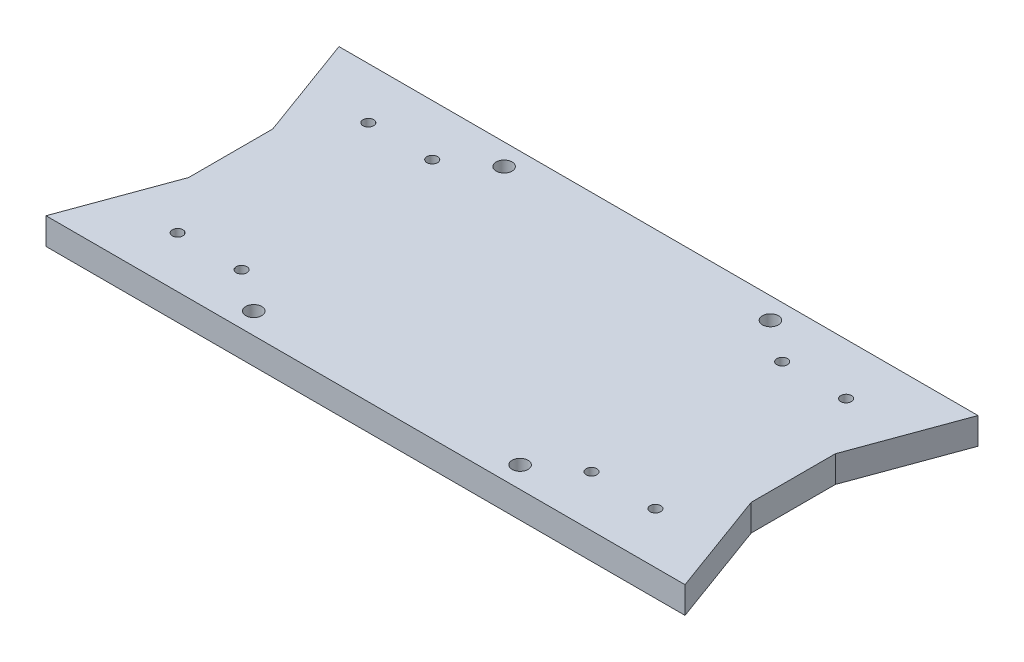
ISO-10303-21;
HEADER;
FILE_DESCRIPTION(('STEP AP214'),'2;1');
FILE_NAME('part.step','',(''),(''),'','','');
FILE_SCHEMA(('AUTOMOTIVE_DESIGN { 1 0 10303 214 1 1 1 1 }'));
ENDSEC;
DATA;
#1=APPLICATION_CONTEXT('core data for automotive mechanical design processes');
#2=APPLICATION_PROTOCOL_DEFINITION('international standard','automotive_design',2000,#1);
#3=PRODUCT_CONTEXT('',#1,'mechanical');
#4=PRODUCT('Part','Part','',(#3));
#5=PRODUCT_RELATED_PRODUCT_CATEGORY('part','',(#4));
#6=PRODUCT_DEFINITION_FORMATION('','',#4);
#7=PRODUCT_DEFINITION_CONTEXT('part definition',#1,'design');
#8=PRODUCT_DEFINITION('design','',#6,#7);
#9=PRODUCT_DEFINITION_SHAPE('','',#8);
#10=(LENGTH_UNIT() NAMED_UNIT(*) SI_UNIT(.MILLI.,.METRE.));
#11=(NAMED_UNIT(*) PLANE_ANGLE_UNIT() SI_UNIT($,.RADIAN.));
#12=(NAMED_UNIT(*) SI_UNIT($,.STERADIAN.) SOLID_ANGLE_UNIT());
#13=UNCERTAINTY_MEASURE_WITH_UNIT(LENGTH_MEASURE(1.E-05),#10,'distance_accuracy_value','');
#14=(GEOMETRIC_REPRESENTATION_CONTEXT(3) GLOBAL_UNCERTAINTY_ASSIGNED_CONTEXT((#13)) GLOBAL_UNIT_ASSIGNED_CONTEXT((#10,
#11,#12)) REPRESENTATION_CONTEXT('',''));
#15=CARTESIAN_POINT('',(0.,0.,0.));
#16=DIRECTION('',(0.,0.,1.));
#17=DIRECTION('',(1.,0.,0.));
#18=AXIS2_PLACEMENT_3D('',#15,#16,#17);
#19=CARTESIAN_POINT('',(-105.394952442636,6.35,-32.7826613509761));
#20=DIRECTION('',(-1.,0.,0.));
#21=DIRECTION('',(0.,0.,1.));
#22=AXIS2_PLACEMENT_3D('',#19,#20,#21);
#23=PLANE('',#22);
#24=DIRECTION('',(0.,0.,1.));
#25=VECTOR('',#24,1.);
#26=CARTESIAN_POINT('',(-105.394952442636,6.35,-32.7826613509761));
#27=LINE('',#26,#25);
#28=CARTESIAN_POINT('',(-105.394952442636,6.35,-77.7376613569761));
#29=VERTEX_POINT('',#28);
#30=CARTESIAN_POINT('',(-105.394952442636,6.35,-57.6776613449761));
#31=VERTEX_POINT('',#30);
#32=EDGE_CURVE('E105',#29,#31,#27,.T.);
#33=ORIENTED_EDGE('',*,*,#32,.F.);
#34=DIRECTION('',(0.,1.,0.));
#35=VECTOR('',#34,1.);
#36=CARTESIAN_POINT('',(-105.394952442636,0.,-77.7376613569761));
#37=LINE('',#36,#35);
#38=CARTESIAN_POINT('',(-105.394952442636,0.,-77.7376613569761));
#39=VERTEX_POINT('',#38);
#40=EDGE_CURVE('E142',#39,#29,#37,.T.);
#41=ORIENTED_EDGE('',*,*,#40,.F.);
#42=DIRECTION('',(0.,0.,-1.));
#43=VECTOR('',#42,1.);
#44=CARTESIAN_POINT('',(-105.394952442636,0.,-32.7826613509761));
#45=LINE('',#44,#43);
#46=CARTESIAN_POINT('',(-105.394952442636,0.,-57.6776613449761));
#47=VERTEX_POINT('',#46);
#48=EDGE_CURVE('E57',#47,#39,#45,.T.);
#49=ORIENTED_EDGE('',*,*,#48,.F.);
#50=DIRECTION('',(0.,1.,0.));
#51=VECTOR('',#50,1.);
#52=CARTESIAN_POINT('',(-105.394952442636,0.,-57.6776613449761));
#53=LINE('',#52,#51);
#54=EDGE_CURVE('E117',#47,#31,#53,.T.);
#55=ORIENTED_EDGE('',*,*,#54,.T.);
#56=EDGE_LOOP('',(#33,#41,#49,#55));
#57=FACE_BOUND('',#56,.T.);
#58=ADVANCED_FACE('F39',(#57),#23,.T.);
#59=CARTESIAN_POINT('',(0.,6.35,0.));
#60=DIRECTION('',(0.,-1.,0.));
#61=DIRECTION('',(0.,0.,-1.));
#62=AXIS2_PLACEMENT_3D('',#59,#60,#61);
#63=PLANE('',#62);
#64=CARTESIAN_POINT('',(-70.0586741186357,6.35,-97.5526613509762));
#65=DIRECTION('',(0.,1.,0.));
#66=DIRECTION('',(0.,0.,1.));
#67=AXIS2_PLACEMENT_3D('',#64,#65,#66);
#68=CIRCLE('',#67,1.90499999999999);
#69=CARTESIAN_POINT('',(-70.0586741186357,6.35,-95.6476613509762));
#70=VERTEX_POINT('',#69);
#71=EDGE_CURVE('E495',#70,#70,#68,.T.);
#72=ORIENTED_EDGE('',*,*,#71,.F.);
#73=EDGE_LOOP('',(#72));
#74=FACE_BOUND('',#73,.T.);
#75=CARTESIAN_POINT('',(-6.5586741186357,6.35,-97.5526613509762));
#76=DIRECTION('',(0.,1.,0.));
#77=DIRECTION('',(0.,0.,1.));
#78=AXIS2_PLACEMENT_3D('',#75,#76,#77);
#79=CIRCLE('',#78,1.90499999999999);
#80=CARTESIAN_POINT('',(-6.5586741186357,6.35,-95.6476613509762));
#81=VERTEX_POINT('',#80);
#82=EDGE_CURVE('E492',#81,#81,#79,.T.);
#83=ORIENTED_EDGE('',*,*,#82,.F.);
#84=EDGE_LOOP('',(#83));
#85=FACE_BOUND('',#84,.T.);
#86=CARTESIAN_POINT('',(-70.0586741186357,6.35,-37.8626613509762));
#87=DIRECTION('',(0.,1.,0.));
#88=DIRECTION('',(0.,0.,1.));
#89=AXIS2_PLACEMENT_3D('',#86,#87,#88);
#90=CIRCLE('',#89,1.90499999999999);
#91=CARTESIAN_POINT('',(-70.0586741186357,6.35,-35.9576613509762));
#92=VERTEX_POINT('',#91);
#93=EDGE_CURVE('E496',#92,#92,#90,.T.);
#94=ORIENTED_EDGE('',*,*,#93,.F.);
#95=EDGE_LOOP('',(#94));
#96=FACE_BOUND('',#95,.T.);
#97=CARTESIAN_POINT('',(-6.5586741186357,6.35,-37.8626613509762));
#98=DIRECTION('',(0.,1.,0.));
#99=DIRECTION('',(0.,0.,1.));
#100=AXIS2_PLACEMENT_3D('',#97,#98,#99);
#101=CIRCLE('',#100,1.90499999999999);
#102=CARTESIAN_POINT('',(-6.5586741186357,6.35,-35.9576613509762));
#103=VERTEX_POINT('',#102);
#104=EDGE_CURVE('E261',#103,#103,#101,.T.);
#105=ORIENTED_EDGE('',*,*,#104,.F.);
#106=EDGE_LOOP('',(#105));
#107=FACE_BOUND('',#106,.T.);
#108=ORIENTED_EDGE('',*,*,#32,.T.);
#109=DIRECTION('',(0.343774305183413,0.,-0.939052302641158));
#110=VECTOR('',#109,1.);
#111=CARTESIAN_POINT('',(-105.394952442636,6.35,-57.6776613449761));
#112=LINE('',#111,#110);
#113=CARTESIAN_POINT('',(-114.508674118636,6.35,-32.7826613509761));
#114=VERTEX_POINT('',#113);
#115=EDGE_CURVE('E109',#114,#31,#112,.T.);
#116=ORIENTED_EDGE('',*,*,#115,.F.);
#117=DIRECTION('',(1.,0.,0.));
#118=VECTOR('',#117,1.);
#119=CARTESIAN_POINT('',(-38.3336654810452,6.35,-32.7826613509761));
#120=LINE('',#119,#118);
#121=CARTESIAN_POINT('',(37.8413431565453,6.35,-32.7826613509761));
#122=VERTEX_POINT('',#121);
#123=EDGE_CURVE('E49',#114,#122,#120,.T.);
#124=ORIENTED_EDGE('',*,*,#123,.T.);
#125=DIRECTION('',(-0.343774305183413,0.,-0.939052302641158));
#126=VECTOR('',#125,1.);
#127=CARTESIAN_POINT('',(28.7276214805453,6.35,-57.6776613449761));
#128=LINE('',#127,#126);
#129=CARTESIAN_POINT('',(28.7276214805453,6.35,-57.6776613449761));
#130=VERTEX_POINT('',#129);
#131=EDGE_CURVE('E182',#122,#130,#128,.T.);
#132=ORIENTED_EDGE('',*,*,#131,.T.);
#133=DIRECTION('',(0.,0.,1.));
#134=VECTOR('',#133,1.);
#135=CARTESIAN_POINT('',(28.7276214805453,6.35,-32.7826613509761));
#136=LINE('',#135,#134);
#137=CARTESIAN_POINT('',(28.7276214805453,6.35,-77.7376613569761));
#138=VERTEX_POINT('',#137);
#139=EDGE_CURVE('E114',#138,#130,#136,.T.);
#140=ORIENTED_EDGE('',*,*,#139,.F.);
#141=DIRECTION('',(0.343774305183414,0.,-0.939052302641158));
#142=VECTOR('',#141,1.);
#143=CARTESIAN_POINT('',(37.8413431565453,6.35,-102.632661350976));
#144=LINE('',#143,#142);
#145=CARTESIAN_POINT('',(37.8413431565453,6.35,-102.632661350976));
#146=VERTEX_POINT('',#145);
#147=EDGE_CURVE('E194',#138,#146,#144,.T.);
#148=ORIENTED_EDGE('',*,*,#147,.T.);
#149=DIRECTION('',(-1.,0.,0.));
#150=VECTOR('',#149,1.);
#151=CARTESIAN_POINT('',(-38.3336654810452,6.35,-102.632661350976));
#152=LINE('',#151,#150);
#153=CARTESIAN_POINT('',(-114.508674118636,6.35,-102.632661350976));
#154=VERTEX_POINT('',#153);
#155=EDGE_CURVE('E11',#146,#154,#152,.T.);
#156=ORIENTED_EDGE('',*,*,#155,.T.);
#157=DIRECTION('',(-0.343774305183414,0.,-0.939052302641158));
#158=VECTOR('',#157,1.);
#159=CARTESIAN_POINT('',(-114.508674118636,6.35,-102.632661350976));
#160=LINE('',#159,#158);
#161=EDGE_CURVE('E111',#29,#154,#160,.T.);
#162=ORIENTED_EDGE('',*,*,#161,.F.);
#163=EDGE_LOOP('',(#108,#116,#124,#132,#140,#148,#156,#162));
#164=FACE_BOUND('',#163,.T.);
#165=CARTESIAN_POINT('',(18.6213431565454,6.35,-44.9476613509761));
#166=DIRECTION('',(0.,1.,0.));
#167=DIRECTION('',(0.,0.,1.));
#168=AXIS2_PLACEMENT_3D('',#165,#166,#167);
#169=CIRCLE('',#168,1.27);
#170=CARTESIAN_POINT('',(18.6213431565454,6.35,-43.6776613509761));
#171=VERTEX_POINT('',#170);
#172=EDGE_CURVE('E214',#171,#171,#169,.T.);
#173=ORIENTED_EDGE('',*,*,#172,.F.);
#174=EDGE_LOOP('',(#173));
#175=FACE_BOUND('',#174,.T.);
#176=CARTESIAN_POINT('',(3.38134315654538,6.35,-44.9476613509761));
#177=DIRECTION('',(0.,1.,0.));
#178=DIRECTION('',(0.,0.,1.));
#179=AXIS2_PLACEMENT_3D('',#176,#177,#178);
#180=CIRCLE('',#179,1.27);
#181=CARTESIAN_POINT('',(3.38134315654538,6.35,-43.6776613509761));
#182=VERTEX_POINT('',#181);
#183=EDGE_CURVE('E222',#182,#182,#180,.T.);
#184=ORIENTED_EDGE('',*,*,#183,.F.);
#185=EDGE_LOOP('',(#184));
#186=FACE_BOUND('',#185,.T.);
#187=CARTESIAN_POINT('',(18.6213431565454,6.35,-90.4076613509761));
#188=DIRECTION('',(0.,1.,0.));
#189=DIRECTION('',(0.,0.,1.));
#190=AXIS2_PLACEMENT_3D('',#187,#188,#189);
#191=CIRCLE('',#190,1.27000000000001);
#192=CARTESIAN_POINT('',(18.6213431565454,6.35,-89.137661350976));
#193=VERTEX_POINT('',#192);
#194=EDGE_CURVE('E230',#193,#193,#191,.T.);
#195=ORIENTED_EDGE('',*,*,#194,.F.);
#196=EDGE_LOOP('',(#195));
#197=FACE_BOUND('',#196,.T.);
#198=CARTESIAN_POINT('',(3.38134315654538,6.35,-90.4076613509761));
#199=DIRECTION('',(0.,1.,0.));
#200=DIRECTION('',(0.,0.,1.));
#201=AXIS2_PLACEMENT_3D('',#198,#199,#200);
#202=CIRCLE('',#201,1.27000000000001);
#203=CARTESIAN_POINT('',(3.38134315654538,6.35,-89.137661350976));
#204=VERTEX_POINT('',#203);
#205=EDGE_CURVE('E238',#204,#204,#202,.T.);
#206=ORIENTED_EDGE('',*,*,#205,.F.);
#207=EDGE_LOOP('',(#206));
#208=FACE_BOUND('',#207,.T.);
#209=CARTESIAN_POINT('',(-95.2886741186358,6.35,-44.9476613509761));
#210=DIRECTION('',(0.,-1.,0.));
#211=DIRECTION('',(0.,0.,1.));
#212=AXIS2_PLACEMENT_3D('',#209,#210,#211);
#213=CIRCLE('',#212,1.27);
#214=CARTESIAN_POINT('',(-95.2886741186358,6.35,-43.6776613509761));
#215=VERTEX_POINT('',#214);
#216=EDGE_CURVE('E149',#215,#215,#213,.T.);
#217=ORIENTED_EDGE('',*,*,#216,.T.);
#218=EDGE_LOOP('',(#217));
#219=FACE_BOUND('',#218,.T.);
#220=CARTESIAN_POINT('',(-80.0486741186358,6.35,-44.9476613509761));
#221=DIRECTION('',(0.,-1.,0.));
#222=DIRECTION('',(0.,0.,1.));
#223=AXIS2_PLACEMENT_3D('',#220,#221,#222);
#224=CIRCLE('',#223,1.27);
#225=CARTESIAN_POINT('',(-80.0486741186358,6.35,-43.6776613509761));
#226=VERTEX_POINT('',#225);
#227=EDGE_CURVE('E157',#226,#226,#224,.T.);
#228=ORIENTED_EDGE('',*,*,#227,.T.);
#229=EDGE_LOOP('',(#228));
#230=FACE_BOUND('',#229,.T.);
#231=CARTESIAN_POINT('',(-95.2886741186358,6.35,-90.4076613509761));
#232=DIRECTION('',(0.,-1.,0.));
#233=DIRECTION('',(0.,0.,1.));
#234=AXIS2_PLACEMENT_3D('',#231,#232,#233);
#235=CIRCLE('',#234,1.27000000000001);
#236=CARTESIAN_POINT('',(-95.2886741186358,6.35,-89.137661350976));
#237=VERTEX_POINT('',#236);
#238=EDGE_CURVE('E165',#237,#237,#235,.T.);
#239=ORIENTED_EDGE('',*,*,#238,.T.);
#240=EDGE_LOOP('',(#239));
#241=FACE_BOUND('',#240,.T.);
#242=CARTESIAN_POINT('',(-80.0486741186358,6.35,-90.4076613509761));
#243=DIRECTION('',(0.,-1.,0.));
#244=DIRECTION('',(0.,0.,1.));
#245=AXIS2_PLACEMENT_3D('',#242,#243,#244);
#246=CIRCLE('',#245,1.27000000000001);
#247=CARTESIAN_POINT('',(-80.0486741186358,6.35,-89.137661350976));
#248=VERTEX_POINT('',#247);
#249=EDGE_CURVE('E173',#248,#248,#246,.T.);
#250=ORIENTED_EDGE('',*,*,#249,.T.);
#251=EDGE_LOOP('',(#250));
#252=FACE_BOUND('',#251,.T.);
#253=ADVANCED_FACE('F106',(#74,#85,#96,#107,#164,#175,#186,#197,#208,#219,#230,#241,#252),#63,.F.);
#254=CARTESIAN_POINT('',(0.,0.,0.));
#255=DIRECTION('',(0.,-1.,0.));
#256=DIRECTION('',(0.,0.,-1.));
#257=AXIS2_PLACEMENT_3D('',#254,#255,#256);
#258=PLANE('',#257);
#259=CARTESIAN_POINT('',(-70.0586741186357,0.,-97.5526613509762));
#260=DIRECTION('',(0.,-1.,0.));
#261=DIRECTION('',(0.,0.,-1.));
#262=AXIS2_PLACEMENT_3D('',#259,#260,#261);
#263=CIRCLE('',#262,1.90499999999999);
#264=CARTESIAN_POINT('',(-70.0586741186357,0.,-99.4576613509762));
#265=VERTEX_POINT('',#264);
#266=EDGE_CURVE('E43',#265,#265,#263,.T.);
#267=ORIENTED_EDGE('',*,*,#266,.F.);
#268=EDGE_LOOP('',(#267));
#269=FACE_BOUND('',#268,.T.);
#270=CARTESIAN_POINT('',(-6.5586741186357,0.,-97.5526613509762));
#271=DIRECTION('',(0.,-1.,0.));
#272=DIRECTION('',(0.,0.,-1.));
#273=AXIS2_PLACEMENT_3D('',#270,#271,#272);
#274=CIRCLE('',#273,1.90499999999999);
#275=CARTESIAN_POINT('',(-6.5586741186357,0.,-99.4576613509762));
#276=VERTEX_POINT('',#275);
#277=EDGE_CURVE('E264',#276,#276,#274,.T.);
#278=ORIENTED_EDGE('',*,*,#277,.F.);
#279=EDGE_LOOP('',(#278));
#280=FACE_BOUND('',#279,.T.);
#281=CARTESIAN_POINT('',(-70.0586741186357,0.,-37.8626613509762));
#282=DIRECTION('',(0.,-1.,0.));
#283=DIRECTION('',(0.,0.,-1.));
#284=AXIS2_PLACEMENT_3D('',#281,#282,#283);
#285=CIRCLE('',#284,1.90499999999999);
#286=CARTESIAN_POINT('',(-70.0586741186357,0.,-39.7676613509762));
#287=VERTEX_POINT('',#286);
#288=EDGE_CURVE('E260',#287,#287,#285,.T.);
#289=ORIENTED_EDGE('',*,*,#288,.F.);
#290=EDGE_LOOP('',(#289));
#291=FACE_BOUND('',#290,.T.);
#292=CARTESIAN_POINT('',(-6.5586741186357,0.,-37.8626613509762));
#293=DIRECTION('',(0.,-1.,0.));
#294=DIRECTION('',(0.,0.,-1.));
#295=AXIS2_PLACEMENT_3D('',#292,#293,#294);
#296=CIRCLE('',#295,1.90499999999999);
#297=CARTESIAN_POINT('',(-6.5586741186357,0.,-39.7676613509762));
#298=VERTEX_POINT('',#297);
#299=EDGE_CURVE('E256',#298,#298,#296,.T.);
#300=ORIENTED_EDGE('',*,*,#299,.F.);
#301=EDGE_LOOP('',(#300));
#302=FACE_BOUND('',#301,.T.);
#303=CARTESIAN_POINT('',(3.38134315654538,0.,-44.9476613509761));
#304=DIRECTION('',(0.,1.,0.));
#305=DIRECTION('',(0.,0.,1.));
#306=AXIS2_PLACEMENT_3D('',#303,#304,#305);
#307=CIRCLE('',#306,1.27);
#308=CARTESIAN_POINT('',(3.38134315654538,0.,-43.6776613509761));
#309=VERTEX_POINT('',#308);
#310=EDGE_CURVE('E218',#309,#309,#307,.T.);
#311=ORIENTED_EDGE('',*,*,#310,.T.);
#312=EDGE_LOOP('',(#311));
#313=FACE_BOUND('',#312,.T.);
#314=CARTESIAN_POINT('',(3.38134315654538,0.,-90.4076613509761));
#315=DIRECTION('',(0.,1.,0.));
#316=DIRECTION('',(0.,0.,1.));
#317=AXIS2_PLACEMENT_3D('',#314,#315,#316);
#318=CIRCLE('',#317,1.27000000000001);
#319=CARTESIAN_POINT('',(3.38134315654538,0.,-89.137661350976));
#320=VERTEX_POINT('',#319);
#321=EDGE_CURVE('E234',#320,#320,#318,.T.);
#322=ORIENTED_EDGE('',*,*,#321,.T.);
#323=EDGE_LOOP('',(#322));
#324=FACE_BOUND('',#323,.T.);
#325=DIRECTION('',(1.,0.,0.));
#326=VECTOR('',#325,1.);
#327=CARTESIAN_POINT('',(-38.3336654810452,0.,-32.7826613509761));
#328=LINE('',#327,#326);
#329=CARTESIAN_POINT('',(-114.508674118636,0.,-32.7826613509761));
#330=VERTEX_POINT('',#329);
#331=CARTESIAN_POINT('',(37.8413431565453,0.,-32.7826613509761));
#332=VERTEX_POINT('',#331);
#333=EDGE_CURVE('E242',#330,#332,#328,.T.);
#334=ORIENTED_EDGE('',*,*,#333,.F.);
#335=DIRECTION('',(0.343774305183413,0.,-0.939052302641158));
#336=VECTOR('',#335,1.);
#337=CARTESIAN_POINT('',(-105.394952442636,0.,-57.6776613449761));
#338=LINE('',#337,#336);
#339=EDGE_CURVE('E122',#330,#47,#338,.T.);
#340=ORIENTED_EDGE('',*,*,#339,.T.);
#341=ORIENTED_EDGE('',*,*,#48,.T.);
#342=DIRECTION('',(-0.343774305183414,0.,-0.939052302641158));
#343=VECTOR('',#342,1.);
#344=CARTESIAN_POINT('',(-114.508674118636,0.,-102.632661350976));
#345=LINE('',#344,#343);
#346=CARTESIAN_POINT('',(-114.508674118636,0.,-102.632661350976));
#347=VERTEX_POINT('',#346);
#348=EDGE_CURVE('E136',#39,#347,#345,.T.);
#349=ORIENTED_EDGE('',*,*,#348,.T.);
#350=DIRECTION('',(-1.,0.,0.));
#351=VECTOR('',#350,1.);
#352=CARTESIAN_POINT('',(-38.3336654810452,0.,-102.632661350976));
#353=LINE('',#352,#351);
#354=CARTESIAN_POINT('',(37.8413431565453,0.,-102.632661350976));
#355=VERTEX_POINT('',#354);
#356=EDGE_CURVE('E247',#355,#347,#353,.T.);
#357=ORIENTED_EDGE('',*,*,#356,.F.);
#358=DIRECTION('',(0.343774305183414,0.,-0.939052302641158));
#359=VECTOR('',#358,1.);
#360=CARTESIAN_POINT('',(37.8413431565453,0.,-102.632661350976));
#361=LINE('',#360,#359);
#362=CARTESIAN_POINT('',(28.7276214805453,0.,-77.7376613569761));
#363=VERTEX_POINT('',#362);
#364=EDGE_CURVE('E198',#363,#355,#361,.T.);
#365=ORIENTED_EDGE('',*,*,#364,.F.);
#366=DIRECTION('',(0.,0.,-1.));
#367=VECTOR('',#366,1.);
#368=CARTESIAN_POINT('',(28.7276214805453,0.,-32.7826613509761));
#369=LINE('',#368,#367);
#370=CARTESIAN_POINT('',(28.7276214805453,0.,-57.6776613449761));
#371=VERTEX_POINT('',#370);
#372=EDGE_CURVE('E251',#371,#363,#369,.T.);
#373=ORIENTED_EDGE('',*,*,#372,.F.);
#374=DIRECTION('',(-0.343774305183413,0.,-0.939052302641158));
#375=VECTOR('',#374,1.);
#376=CARTESIAN_POINT('',(28.7276214805453,0.,-57.6776613449761));
#377=LINE('',#376,#375);
#378=EDGE_CURVE('E183',#332,#371,#377,.T.);
#379=ORIENTED_EDGE('',*,*,#378,.F.);
#380=EDGE_LOOP('',(#334,#340,#341,#349,#357,#365,#373,#379));
#381=FACE_BOUND('',#380,.T.);
#382=CARTESIAN_POINT('',(18.6213431565454,0.,-90.4076613509761));
#383=DIRECTION('',(0.,1.,0.));
#384=DIRECTION('',(0.,0.,1.));
#385=AXIS2_PLACEMENT_3D('',#382,#383,#384);
#386=CIRCLE('',#385,1.27000000000001);
#387=CARTESIAN_POINT('',(18.6213431565454,0.,-89.137661350976));
#388=VERTEX_POINT('',#387);
#389=EDGE_CURVE('E226',#388,#388,#386,.T.);
#390=ORIENTED_EDGE('',*,*,#389,.T.);
#391=EDGE_LOOP('',(#390));
#392=FACE_BOUND('',#391,.T.);
#393=CARTESIAN_POINT('',(18.6213431565454,0.,-44.9476613509761));
#394=DIRECTION('',(0.,1.,0.));
#395=DIRECTION('',(0.,0.,1.));
#396=AXIS2_PLACEMENT_3D('',#393,#394,#395);
#397=CIRCLE('',#396,1.27);
#398=CARTESIAN_POINT('',(18.6213431565454,0.,-43.6776613509761));
#399=VERTEX_POINT('',#398);
#400=EDGE_CURVE('E210',#399,#399,#397,.T.);
#401=ORIENTED_EDGE('',*,*,#400,.T.);
#402=EDGE_LOOP('',(#401));
#403=FACE_BOUND('',#402,.T.);
#404=CARTESIAN_POINT('',(-95.2886741186358,0.,-44.9476613509761));
#405=DIRECTION('',(0.,-1.,0.));
#406=DIRECTION('',(0.,0.,1.));
#407=AXIS2_PLACEMENT_3D('',#404,#405,#406);
#408=CIRCLE('',#407,1.27);
#409=CARTESIAN_POINT('',(-95.2886741186358,0.,-43.6776613509761));
#410=VERTEX_POINT('',#409);
#411=EDGE_CURVE('E145',#410,#410,#408,.T.);
#412=ORIENTED_EDGE('',*,*,#411,.F.);
#413=EDGE_LOOP('',(#412));
#414=FACE_BOUND('',#413,.T.);
#415=CARTESIAN_POINT('',(-80.0486741186358,0.,-44.9476613509761));
#416=DIRECTION('',(0.,-1.,0.));
#417=DIRECTION('',(0.,0.,1.));
#418=AXIS2_PLACEMENT_3D('',#415,#416,#417);
#419=CIRCLE('',#418,1.27);
#420=CARTESIAN_POINT('',(-80.0486741186358,0.,-43.6776613509761));
#421=VERTEX_POINT('',#420);
#422=EDGE_CURVE('E153',#421,#421,#419,.T.);
#423=ORIENTED_EDGE('',*,*,#422,.F.);
#424=EDGE_LOOP('',(#423));
#425=FACE_BOUND('',#424,.T.);
#426=CARTESIAN_POINT('',(-95.2886741186358,0.,-90.4076613509761));
#427=DIRECTION('',(0.,-1.,0.));
#428=DIRECTION('',(0.,0.,1.));
#429=AXIS2_PLACEMENT_3D('',#426,#427,#428);
#430=CIRCLE('',#429,1.27000000000001);
#431=CARTESIAN_POINT('',(-95.2886741186358,0.,-89.137661350976));
#432=VERTEX_POINT('',#431);
#433=EDGE_CURVE('E161',#432,#432,#430,.T.);
#434=ORIENTED_EDGE('',*,*,#433,.F.);
#435=EDGE_LOOP('',(#434));
#436=FACE_BOUND('',#435,.T.);
#437=CARTESIAN_POINT('',(-80.0486741186358,0.,-90.4076613509761));
#438=DIRECTION('',(0.,-1.,0.));
#439=DIRECTION('',(0.,0.,1.));
#440=AXIS2_PLACEMENT_3D('',#437,#438,#439);
#441=CIRCLE('',#440,1.27000000000001);
#442=CARTESIAN_POINT('',(-80.0486741186358,0.,-89.137661350976));
#443=VERTEX_POINT('',#442);
#444=EDGE_CURVE('E169',#443,#443,#441,.T.);
#445=ORIENTED_EDGE('',*,*,#444,.F.);
#446=EDGE_LOOP('',(#445));
#447=FACE_BOUND('',#446,.T.);
#448=ADVANCED_FACE('F276',(#269,#280,#291,#302,#313,#324,#381,#392,#403,#414,#425,#436,#447),
#258,.T.);
#449=CARTESIAN_POINT('',(-38.3336654810452,6.35,-32.7826613509761));
#450=DIRECTION('',(0.,0.,-1.));
#451=DIRECTION('',(-1.,0.,0.));
#452=AXIS2_PLACEMENT_3D('',#449,#450,#451);
#453=PLANE('',#452);
#454=ORIENTED_EDGE('',*,*,#333,.T.);
#455=DIRECTION('',(0.,1.,0.));
#456=VECTOR('',#455,1.);
#457=CARTESIAN_POINT('',(37.8413431565453,0.,-32.7826613509761));
#458=LINE('',#457,#456);
#459=EDGE_CURVE('E186',#332,#122,#458,.T.);
#460=ORIENTED_EDGE('',*,*,#459,.T.);
#461=ORIENTED_EDGE('',*,*,#123,.F.);
#462=DIRECTION('',(0.,1.,0.));
#463=VECTOR('',#462,1.);
#464=CARTESIAN_POINT('',(-114.508674118636,0.,-32.7826613509761));
#465=LINE('',#464,#463);
#466=EDGE_CURVE('E121',#330,#114,#465,.T.);
#467=ORIENTED_EDGE('',*,*,#466,.F.);
#468=EDGE_LOOP('',(#454,#460,#461,#467));
#469=FACE_BOUND('',#468,.T.);
#470=ADVANCED_FACE('F41',(#469),#453,.F.);
#471=CARTESIAN_POINT('',(28.7276214805453,6.35,-32.7826613509761));
#472=DIRECTION('',(-1.,0.,0.));
#473=DIRECTION('',(0.,0.,1.));
#474=AXIS2_PLACEMENT_3D('',#471,#472,#473);
#475=PLANE('',#474);
#476=DIRECTION('',(0.,1.,0.));
#477=VECTOR('',#476,1.);
#478=CARTESIAN_POINT('',(28.7276214805453,0.,-77.7376613569761));
#479=LINE('',#478,#477);
#480=EDGE_CURVE('E202',#363,#138,#479,.T.);
#481=ORIENTED_EDGE('',*,*,#480,.T.);
#482=ORIENTED_EDGE('',*,*,#139,.T.);
#483=DIRECTION('',(0.,1.,0.));
#484=VECTOR('',#483,1.);
#485=CARTESIAN_POINT('',(28.7276214805453,0.,-57.6776613449761));
#486=LINE('',#485,#484);
#487=EDGE_CURVE('E190',#371,#130,#486,.T.);
#488=ORIENTED_EDGE('',*,*,#487,.F.);
#489=ORIENTED_EDGE('',*,*,#372,.T.);
#490=EDGE_LOOP('',(#481,#482,#488,#489));
#491=FACE_BOUND('',#490,.T.);
#492=ADVANCED_FACE('F348',(#491),#475,.F.);
#493=CARTESIAN_POINT('',(-38.3336654810452,6.35,-102.632661350976));
#494=DIRECTION('',(0.,0.,1.));
#495=DIRECTION('',(1.,0.,0.));
#496=AXIS2_PLACEMENT_3D('',#493,#494,#495);
#497=PLANE('',#496);
#498=ORIENTED_EDGE('',*,*,#356,.T.);
#499=DIRECTION('',(0.,1.,0.));
#500=VECTOR('',#499,1.);
#501=CARTESIAN_POINT('',(-114.508674118636,0.,-102.632661350976));
#502=LINE('',#501,#500);
#503=EDGE_CURVE('E139',#347,#154,#502,.T.);
#504=ORIENTED_EDGE('',*,*,#503,.T.);
#505=ORIENTED_EDGE('',*,*,#155,.F.);
#506=DIRECTION('',(0.,1.,0.));
#507=VECTOR('',#506,1.);
#508=CARTESIAN_POINT('',(37.8413431565453,0.,-102.632661350976));
#509=LINE('',#508,#507);
#510=EDGE_CURVE('E206',#355,#146,#509,.T.);
#511=ORIENTED_EDGE('',*,*,#510,.F.);
#512=EDGE_LOOP('',(#498,#504,#505,#511));
#513=FACE_BOUND('',#512,.T.);
#514=ADVANCED_FACE('F344',(#513),#497,.F.);
#515=CARTESIAN_POINT('',(3.38134315654538,6.35,-90.4076613509761));
#516=DIRECTION('',(0.,-1.,0.));
#517=DIRECTION('',(0.,0.,-1.));
#518=AXIS2_PLACEMENT_3D('',#515,#516,#517);
#519=CYLINDRICAL_SURFACE('',#518,1.27000000000001);
#520=ORIENTED_EDGE('',*,*,#205,.T.);
#521=EDGE_LOOP('',(#520));
#522=FACE_BOUND('',#521,.T.);
#523=ORIENTED_EDGE('',*,*,#321,.F.);
#524=EDGE_LOOP('',(#523));
#525=FACE_BOUND('',#524,.T.);
#526=ADVANCED_FACE('F341',(#522,#525),#519,.F.);
#527=CARTESIAN_POINT('',(18.6213431565454,6.35,-90.4076613509761));
#528=DIRECTION('',(0.,-1.,0.));
#529=DIRECTION('',(0.,0.,-1.));
#530=AXIS2_PLACEMENT_3D('',#527,#528,#529);
#531=CYLINDRICAL_SURFACE('',#530,1.27000000000001);
#532=ORIENTED_EDGE('',*,*,#194,.T.);
#533=EDGE_LOOP('',(#532));
#534=FACE_BOUND('',#533,.T.);
#535=ORIENTED_EDGE('',*,*,#389,.F.);
#536=EDGE_LOOP('',(#535));
#537=FACE_BOUND('',#536,.T.);
#538=ADVANCED_FACE('F337',(#534,#537),#531,.F.);
#539=CARTESIAN_POINT('',(3.38134315654538,6.35,-44.9476613509761));
#540=DIRECTION('',(0.,-1.,0.));
#541=DIRECTION('',(0.,0.,-1.));
#542=AXIS2_PLACEMENT_3D('',#539,#540,#541);
#543=CYLINDRICAL_SURFACE('',#542,1.27);
#544=ORIENTED_EDGE('',*,*,#183,.T.);
#545=EDGE_LOOP('',(#544));
#546=FACE_BOUND('',#545,.T.);
#547=ORIENTED_EDGE('',*,*,#310,.F.);
#548=EDGE_LOOP('',(#547));
#549=FACE_BOUND('',#548,.T.);
#550=ADVANCED_FACE('F333',(#546,#549),#543,.F.);
#551=CARTESIAN_POINT('',(18.6213431565454,6.35,-44.9476613509761));
#552=DIRECTION('',(0.,-1.,0.));
#553=DIRECTION('',(0.,0.,-1.));
#554=AXIS2_PLACEMENT_3D('',#551,#552,#553);
#555=CYLINDRICAL_SURFACE('',#554,1.27);
#556=ORIENTED_EDGE('',*,*,#172,.T.);
#557=EDGE_LOOP('',(#556));
#558=FACE_BOUND('',#557,.T.);
#559=ORIENTED_EDGE('',*,*,#400,.F.);
#560=EDGE_LOOP('',(#559));
#561=FACE_BOUND('',#560,.T.);
#562=ADVANCED_FACE('F329',(#558,#561),#555,.F.);
#563=CARTESIAN_POINT('',(37.8413431565453,0.,-102.632661350976));
#564=DIRECTION('',(0.939052302641158,0.,0.343774305183414));
#565=DIRECTION('',(0.343774305183414,0.,-0.939052302641158));
#566=AXIS2_PLACEMENT_3D('',#563,#564,#565);
#567=PLANE('',#566);
#568=ORIENTED_EDGE('',*,*,#147,.F.);
#569=ORIENTED_EDGE('',*,*,#480,.F.);
#570=ORIENTED_EDGE('',*,*,#364,.T.);
#571=ORIENTED_EDGE('',*,*,#510,.T.);
#572=EDGE_LOOP('',(#568,#569,#570,#571));
#573=FACE_BOUND('',#572,.T.);
#574=ADVANCED_FACE('F315',(#573),#567,.T.);
#575=CARTESIAN_POINT('',(28.7276214805453,0.,-57.6776613449761));
#576=DIRECTION('',(0.939052302641158,0.,-0.343774305183413));
#577=DIRECTION('',(-0.343774305183413,0.,-0.939052302641158));
#578=AXIS2_PLACEMENT_3D('',#575,#576,#577);
#579=PLANE('',#578);
#580=ORIENTED_EDGE('',*,*,#131,.F.);
#581=ORIENTED_EDGE('',*,*,#459,.F.);
#582=ORIENTED_EDGE('',*,*,#378,.T.);
#583=ORIENTED_EDGE('',*,*,#487,.T.);
#584=EDGE_LOOP('',(#580,#581,#582,#583));
#585=FACE_BOUND('',#584,.T.);
#586=ADVANCED_FACE('F305',(#585),#579,.T.);
#587=CARTESIAN_POINT('',(-80.0486741186358,6.35,-90.4076613509761));
#588=DIRECTION('',(0.,-1.,0.));
#589=DIRECTION('',(0.,0.,-1.));
#590=AXIS2_PLACEMENT_3D('',#587,#588,#589);
#591=CYLINDRICAL_SURFACE('',#590,1.27000000000001);
#592=ORIENTED_EDGE('',*,*,#249,.F.);
#593=EDGE_LOOP('',(#592));
#594=FACE_BOUND('',#593,.T.);
#595=ORIENTED_EDGE('',*,*,#444,.T.);
#596=EDGE_LOOP('',(#595));
#597=FACE_BOUND('',#596,.T.);
#598=ADVANCED_FACE('F302',(#594,#597),#591,.F.);
#599=CARTESIAN_POINT('',(-95.2886741186358,6.35,-90.4076613509761));
#600=DIRECTION('',(0.,-1.,0.));
#601=DIRECTION('',(0.,0.,-1.));
#602=AXIS2_PLACEMENT_3D('',#599,#600,#601);
#603=CYLINDRICAL_SURFACE('',#602,1.27000000000001);
#604=ORIENTED_EDGE('',*,*,#238,.F.);
#605=EDGE_LOOP('',(#604));
#606=FACE_BOUND('',#605,.T.);
#607=ORIENTED_EDGE('',*,*,#433,.T.);
#608=EDGE_LOOP('',(#607));
#609=FACE_BOUND('',#608,.T.);
#610=ADVANCED_FACE('F304',(#606,#609),#603,.F.);
#611=CARTESIAN_POINT('',(-80.0486741186358,6.35,-44.9476613509761));
#612=DIRECTION('',(0.,-1.,0.));
#613=DIRECTION('',(0.,0.,-1.));
#614=AXIS2_PLACEMENT_3D('',#611,#612,#613);
#615=CYLINDRICAL_SURFACE('',#614,1.27);
#616=ORIENTED_EDGE('',*,*,#227,.F.);
#617=EDGE_LOOP('',(#616));
#618=FACE_BOUND('',#617,.T.);
#619=ORIENTED_EDGE('',*,*,#422,.T.);
#620=EDGE_LOOP('',(#619));
#621=FACE_BOUND('',#620,.T.);
#622=ADVANCED_FACE('F312',(#618,#621),#615,.F.);
#623=CARTESIAN_POINT('',(-95.2886741186358,6.35,-44.9476613509761));
#624=DIRECTION('',(0.,-1.,0.));
#625=DIRECTION('',(0.,0.,-1.));
#626=AXIS2_PLACEMENT_3D('',#623,#624,#625);
#627=CYLINDRICAL_SURFACE('',#626,1.27);
#628=ORIENTED_EDGE('',*,*,#216,.F.);
#629=EDGE_LOOP('',(#628));
#630=FACE_BOUND('',#629,.T.);
#631=ORIENTED_EDGE('',*,*,#411,.T.);
#632=EDGE_LOOP('',(#631));
#633=FACE_BOUND('',#632,.T.);
#634=ADVANCED_FACE('F369',(#630,#633),#627,.F.);
#635=CARTESIAN_POINT('',(-114.508674118636,0.,-102.632661350976));
#636=DIRECTION('',(0.939052302641158,0.,-0.343774305183414));
#637=DIRECTION('',(-0.343774305183414,0.,-0.939052302641158));
#638=AXIS2_PLACEMENT_3D('',#635,#636,#637);
#639=PLANE('',#638);
#640=ORIENTED_EDGE('',*,*,#161,.T.);
#641=ORIENTED_EDGE('',*,*,#503,.F.);
#642=ORIENTED_EDGE('',*,*,#348,.F.);
#643=ORIENTED_EDGE('',*,*,#40,.T.);
#644=EDGE_LOOP('',(#640,#641,#642,#643));
#645=FACE_BOUND('',#644,.T.);
#646=ADVANCED_FACE('F367',(#645),#639,.F.);
#647=CARTESIAN_POINT('',(-105.394952442636,0.,-57.6776613449761));
#648=DIRECTION('',(0.939052302641158,0.,0.343774305183413));
#649=DIRECTION('',(0.343774305183413,0.,-0.939052302641158));
#650=AXIS2_PLACEMENT_3D('',#647,#648,#649);
#651=PLANE('',#650);
#652=ORIENTED_EDGE('',*,*,#115,.T.);
#653=ORIENTED_EDGE('',*,*,#54,.F.);
#654=ORIENTED_EDGE('',*,*,#339,.F.);
#655=ORIENTED_EDGE('',*,*,#466,.T.);
#656=EDGE_LOOP('',(#652,#653,#654,#655));
#657=FACE_BOUND('',#656,.T.);
#658=ADVANCED_FACE('F125',(#657),#651,.F.);
#659=CARTESIAN_POINT('',(-6.5586741186357,-7.36600000000001,-37.8626613509762));
#660=DIRECTION('',(0.,1.,0.));
#661=DIRECTION('',(0.,0.,1.));
#662=AXIS2_PLACEMENT_3D('',#659,#660,#661);
#663=CYLINDRICAL_SURFACE('',#662,1.90499999999999);
#664=ORIENTED_EDGE('',*,*,#299,.T.);
#665=EDGE_LOOP('',(#664));
#666=FACE_BOUND('',#665,.T.);
#667=ORIENTED_EDGE('',*,*,#104,.T.);
#668=EDGE_LOOP('',(#667));
#669=FACE_BOUND('',#668,.T.);
#670=ADVANCED_FACE('F375',(#666,#669),#663,.F.);
#671=CARTESIAN_POINT('',(-70.0586741186357,-7.36600000000001,-37.8626613509762));
#672=DIRECTION('',(0.,1.,0.));
#673=DIRECTION('',(0.,0.,1.));
#674=AXIS2_PLACEMENT_3D('',#671,#672,#673);
#675=CYLINDRICAL_SURFACE('',#674,1.90499999999999);
#676=ORIENTED_EDGE('',*,*,#288,.T.);
#677=EDGE_LOOP('',(#676));
#678=FACE_BOUND('',#677,.T.);
#679=ORIENTED_EDGE('',*,*,#93,.T.);
#680=EDGE_LOOP('',(#679));
#681=FACE_BOUND('',#680,.T.);
#682=ADVANCED_FACE('F459',(#678,#681),#675,.F.);
#683=CARTESIAN_POINT('',(-6.5586741186357,-7.36600000000001,-97.5526613509762));
#684=DIRECTION('',(0.,1.,0.));
#685=DIRECTION('',(0.,0.,1.));
#686=AXIS2_PLACEMENT_3D('',#683,#684,#685);
#687=CYLINDRICAL_SURFACE('',#686,1.90499999999999);
#688=ORIENTED_EDGE('',*,*,#277,.T.);
#689=EDGE_LOOP('',(#688));
#690=FACE_BOUND('',#689,.T.);
#691=ORIENTED_EDGE('',*,*,#82,.T.);
#692=EDGE_LOOP('',(#691));
#693=FACE_BOUND('',#692,.T.);
#694=ADVANCED_FACE('F468',(#690,#693),#687,.F.);
#695=CARTESIAN_POINT('',(-70.0586741186357,-7.36600000000001,-97.5526613509762));
#696=DIRECTION('',(0.,1.,0.));
#697=DIRECTION('',(0.,0.,1.));
#698=AXIS2_PLACEMENT_3D('',#695,#696,#697);
#699=CYLINDRICAL_SURFACE('',#698,1.90499999999999);
#700=ORIENTED_EDGE('',*,*,#266,.T.);
#701=EDGE_LOOP('',(#700));
#702=FACE_BOUND('',#701,.T.);
#703=ORIENTED_EDGE('',*,*,#71,.T.);
#704=EDGE_LOOP('',(#703));
#705=FACE_BOUND('',#704,.T.);
#706=ADVANCED_FACE('F273',(#702,#705),#699,.F.);
#707=CLOSED_SHELL('',(#58,#253,#448,#470,#492,#514,#526,#538,#550,#562,#574,#586,#598,#610,#622,
#634,#646,#658,#670,#682,#694,#706));
#708=MANIFOLD_SOLID_BREP('B2',#707);
#709=ADVANCED_BREP_SHAPE_REPRESENTATION('',(#18,#708),#14);
#710=SHAPE_DEFINITION_REPRESENTATION(#9,#709);
ENDSEC;
END-ISO-10303-21;
